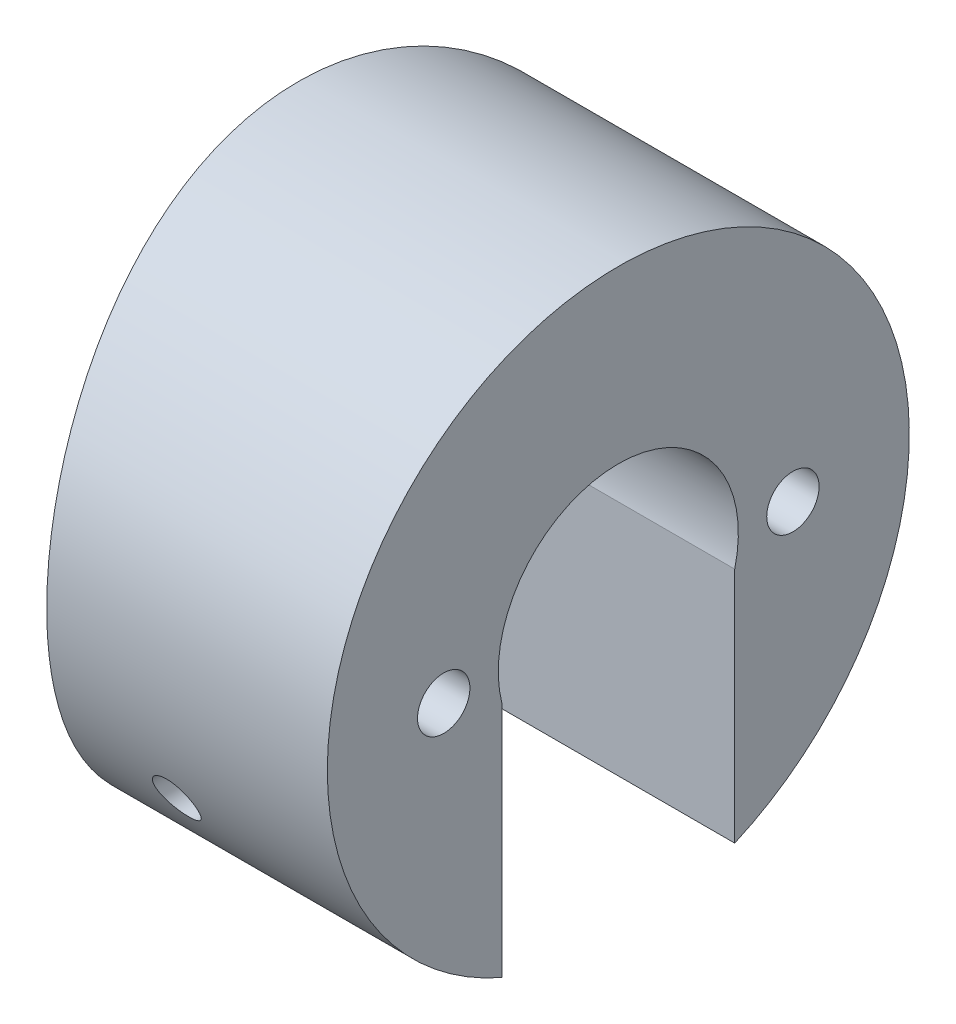
ISO-10303-21;
HEADER;
FILE_DESCRIPTION(('STEP AP214'),'2;1');
FILE_NAME('part.step','',(''),(''),'','','');
FILE_SCHEMA(('AUTOMOTIVE_DESIGN { 1 0 10303 214 1 1 1 1 }'));
ENDSEC;
DATA;
#1=APPLICATION_CONTEXT('core data for automotive mechanical design processes');
#2=APPLICATION_PROTOCOL_DEFINITION('international standard','automotive_design',2000,#1);
#3=PRODUCT_CONTEXT('',#1,'mechanical');
#4=PRODUCT('Part','Part','',(#3));
#5=PRODUCT_RELATED_PRODUCT_CATEGORY('part','',(#4));
#6=PRODUCT_DEFINITION_FORMATION('','',#4);
#7=PRODUCT_DEFINITION_CONTEXT('part definition',#1,'design');
#8=PRODUCT_DEFINITION('design','',#6,#7);
#9=PRODUCT_DEFINITION_SHAPE('','',#8);
#10=(LENGTH_UNIT() NAMED_UNIT(*) SI_UNIT(.MILLI.,.METRE.));
#11=(NAMED_UNIT(*) PLANE_ANGLE_UNIT() SI_UNIT($,.RADIAN.));
#12=(NAMED_UNIT(*) SI_UNIT($,.STERADIAN.) SOLID_ANGLE_UNIT());
#13=UNCERTAINTY_MEASURE_WITH_UNIT(LENGTH_MEASURE(1.E-05),#10,'distance_accuracy_value','');
#14=(GEOMETRIC_REPRESENTATION_CONTEXT(3) GLOBAL_UNCERTAINTY_ASSIGNED_CONTEXT((#13)) GLOBAL_UNIT_ASSIGNED_CONTEXT((#10,
#11,#12)) REPRESENTATION_CONTEXT('',''));
#15=CARTESIAN_POINT('',(0.,0.,0.));
#16=DIRECTION('',(0.,0.,1.));
#17=DIRECTION('',(1.,0.,0.));
#18=AXIS2_PLACEMENT_3D('',#15,#16,#17);
#19=CARTESIAN_POINT('',(22.,0.,0.));
#20=DIRECTION('',(-1.,0.,0.));
#21=DIRECTION('',(0.,0.,1.));
#22=AXIS2_PLACEMENT_3D('',#19,#20,#21);
#23=CYLINDRICAL_SURFACE('',#22,20.);
#24=CARTESIAN_POINT('',(22.,0.,0.));
#25=DIRECTION('',(1.,0.,0.));
#26=DIRECTION('',(0.,0.,-1.));
#27=AXIS2_PLACEMENT_3D('',#24,#25,#26);
#28=CIRCLE('',#27,20.);
#29=CARTESIAN_POINT('',(22.,-18.3303027798234,-8.));
#30=VERTEX_POINT('',#29);
#31=CARTESIAN_POINT('',(22.,-18.3303027798234,8.));
#32=VERTEX_POINT('',#31);
#33=EDGE_CURVE('E11',#30,#32,#28,.T.);
#34=ORIENTED_EDGE('',*,*,#33,.F.);
#35=DIRECTION('',(1.,0.,0.));
#36=VECTOR('',#35,1.);
#37=CARTESIAN_POINT('',(3.,-18.3303027798234,-8.));
#38=LINE('',#37,#36);
#39=CARTESIAN_POINT('',(3.,-18.3303027798234,-8.));
#40=VERTEX_POINT('',#39);
#41=EDGE_CURVE('E99',#40,#30,#38,.T.);
#42=ORIENTED_EDGE('',*,*,#41,.F.);
#43=CARTESIAN_POINT('',(3.,0.,0.));
#44=DIRECTION('',(1.,0.,0.));
#45=DIRECTION('',(0.,0.,-1.));
#46=AXIS2_PLACEMENT_3D('',#43,#44,#45);
#47=CIRCLE('',#46,20.);
#48=CARTESIAN_POINT('',(3.,-18.3303027798234,8.));
#49=VERTEX_POINT('',#48);
#50=EDGE_CURVE('E104',#49,#40,#47,.T.);
#51=ORIENTED_EDGE('',*,*,#50,.F.);
#52=DIRECTION('',(1.,0.,0.));
#53=VECTOR('',#52,1.);
#54=CARTESIAN_POINT('',(3.,-18.3303027798234,8.));
#55=LINE('',#54,#53);
#56=EDGE_CURVE('E88',#49,#32,#55,.T.);
#57=ORIENTED_EDGE('',*,*,#56,.T.);
#58=EDGE_LOOP('',(#34,#42,#51,#57));
#59=FACE_BOUND('',#58,.T.);
#60=CARTESIAN_POINT('',(2.71583852599519,0.,20.));
#61=CARTESIAN_POINT('',(2.71583720419908,0.550918368629555,19.9999979955262));
#62=CARTESIAN_POINT('',(2.70952307294359,1.10187503845956,19.9772172985185));
#63=CARTESIAN_POINT('',(2.68445738640584,2.1997741525709,19.8862887267972));
#64=CARTESIAN_POINT('',(2.66570466817441,2.74671621667071,19.818136610068));
#65=CARTESIAN_POINT('',(2.61632654224703,3.83283472874256,19.6370216003391));
#66=CARTESIAN_POINT('',(2.58569585426865,4.3720076122554,19.5240387775898));
#67=CARTESIAN_POINT('',(2.51348978860518,5.43849703067202,19.2542283143095));
#68=CARTESIAN_POINT('',(2.4719146207721,5.96581379269742,19.0974015144497));
#69=CARTESIAN_POINT('',(2.37912003517492,7.00423404343053,18.7414391089101));
#70=CARTESIAN_POINT('',(2.32791448031755,7.51535961864346,18.5423642668867));
#71=CARTESIAN_POINT('',(2.21730121654067,8.51880006208397,18.1033138320795));
#72=CARTESIAN_POINT('',(2.15789347626827,9.01111485839805,17.8633380829508));
#73=CARTESIAN_POINT('',(2.03254969547388,9.97379657844629,17.3442340818241));
#74=CARTESIAN_POINT('',(1.96661339403171,10.4441626238714,17.0651042648105));
#75=CARTESIAN_POINT('',(1.83003053260491,11.3599958582745,16.4696340357336));
#76=CARTESIAN_POINT('',(1.7593838927973,11.8054626250655,16.1532929930068));
#77=CARTESIAN_POINT('',(1.61365604823284,12.6785221427699,15.4779359071113));
#78=CARTESIAN_POINT('',(1.53851069818374,13.1054831814473,15.1181168094535));
#79=CARTESIAN_POINT('',(1.38737000475925,13.927766105388,14.3641394304632));
#80=CARTESIAN_POINT('',(1.31137464949402,14.3230875474461,13.9699806682643));
#81=CARTESIAN_POINT('',(1.16060916641372,15.0795578950723,13.1498357209291));
#82=CARTESIAN_POINT('',(1.0858391620587,15.4407033745363,12.7238463524525));
#83=CARTESIAN_POINT('',(0.939569981410207,16.1263607771595,11.8428070794406));
#84=CARTESIAN_POINT('',(0.868070822169677,16.4508725093371,11.3877570234234));
#85=CARTESIAN_POINT('',(0.729185410938314,17.0659051030184,10.4440019186042));
#86=CARTESIAN_POINT('',(0.661883679341344,17.3557961932459,9.95487366219161));
#87=CARTESIAN_POINT('',(0.534574695396652,17.8932321652887,8.95295539825706));
#88=CARTESIAN_POINT('',(0.47456754471148,18.140776456948,8.44016506110064));
#89=CARTESIAN_POINT('',(0.363570717175421,18.5915117491791,7.39457532709894));
#90=CARTESIAN_POINT('',(0.312579865798712,18.7947085275753,6.86177854741084));
#91=CARTESIAN_POINT('',(0.221081799935856,19.1550779678764,5.77996599006893));
#92=CARTESIAN_POINT('',(0.180574306630333,19.3122518538382,5.23095064420305));
#93=CARTESIAN_POINT('',(0.112021066604811,19.5761398421684,4.13351206913606));
#94=CARTESIAN_POINT('',(0.0837111230618383,19.6839273166135,3.58536334092753));
#95=CARTESIAN_POINT('',(0.0390282051130342,19.8533116675331,2.4814919821342));
#96=CARTESIAN_POINT('',(0.0226550656279587,19.9149091827889,1.92576945639901));
#97=CARTESIAN_POINT('',(0.00231287184317546,19.9913590232856,0.810972743979539));
#98=CARTESIAN_POINT('',(-0.00165798564619358,20.0062181439063,0.251899056370222));
#99=CARTESIAN_POINT('',(0.00291290405673769,19.9890756548836,-0.865473785968115));
#100=CARTESIAN_POINT('',(0.0114544730304575,19.9570747126834,-1.42377295161553));
#101=CARTESIAN_POINT('',(0.0404339869592479,19.8479018321359,-2.52135571769307));
#102=CARTESIAN_POINT('',(0.0605659765902263,19.7718913424225,-3.06076341662817));
#103=CARTESIAN_POINT('',(0.111941054107678,19.5762680740784,-4.13106184083254));
#104=CARTESIAN_POINT('',(0.143183922711534,19.4566561559578,-4.66195273397211));
#105=CARTESIAN_POINT('',(0.215946928393699,19.1748040741018,-5.71158477741187));
#106=CARTESIAN_POINT('',(0.257467421868833,19.0125624320849,-6.23032550569826));
#107=CARTESIAN_POINT('',(0.349687153961002,18.6467294349784,-7.25217189173379));
#108=CARTESIAN_POINT('',(0.400386537541423,18.443137426831,-7.7552773024053));
#109=CARTESIAN_POINT('',(0.510180514018348,17.9939181773118,-8.74748028027973));
#110=CARTESIAN_POINT('',(0.56935336775221,17.7478941379886,-9.2363894798745));
#111=CARTESIAN_POINT('',(0.694148187869852,17.2170307081084,-10.1917867213776));
#112=CARTESIAN_POINT('',(0.759770176450058,16.9321911839563,-10.6582746861091));
#113=CARTESIAN_POINT('',(0.895758703670676,16.3256216075623,-11.5659888188201));
#114=CARTESIAN_POINT('',(0.966126011005286,16.0038855725124,-12.0072108724652));
#115=CARTESIAN_POINT('',(1.10976484930651,15.3256861572232,-12.86160363953));
#116=CARTESIAN_POINT('',(1.18303644148927,14.9692220447586,-13.2747737611759));
#117=CARTESIAN_POINT('',(1.33284428810774,14.2123742214188,-14.0827611991668));
#118=CARTESIAN_POINT('',(1.40941167732709,13.8109775618472,-14.4766245221965));
#119=CARTESIAN_POINT('',(1.56147492697535,12.976336337106,-15.2292640199665));
#120=CARTESIAN_POINT('',(1.63697076475668,12.5430910999988,-15.5880394540543));
#121=CARTESIAN_POINT('',(1.78476784142875,11.6475416526047,-16.2680947594536));
#122=CARTESIAN_POINT('',(1.85706886150449,11.1852354571523,-16.5893720649617));
#123=CARTESIAN_POINT('',(1.99639557790192,10.234611796305,-17.1921338759909));
#124=CARTESIAN_POINT('',(2.06342129853029,9.74629445077744,-17.4736185648671));
#125=CARTESIAN_POINT('',(2.19062493961388,8.74378523222317,-17.9963259710692));
#126=CARTESIAN_POINT('',(2.25075776920321,8.22945155829049,-18.2372879132319));
#127=CARTESIAN_POINT('',(2.36185979063246,7.18129056511593,-18.6748920170533));
#128=CARTESIAN_POINT('',(2.41282891253737,6.64746309713994,-18.8715338404755));
#129=CARTESIAN_POINT('',(2.50400123028059,5.56425978861829,-19.2188038342948));
#130=CARTESIAN_POINT('',(2.54420661443119,5.0148871336236,-19.3694413584335));
#131=CARTESIAN_POINT('',(2.61257838013558,3.9045821944646,-19.6234178199717));
#132=CARTESIAN_POINT('',(2.64074512950106,3.34365026401526,-19.726758202429));
#133=CARTESIAN_POINT('',(2.68347601664323,2.23140756936548,-19.8828242188132));
#134=CARTESIAN_POINT('',(2.69842161742293,1.68031046308461,-19.9369705715048));
#135=CARTESIAN_POINT('',(2.71565957980208,0.575330472434,-19.9993798372479));
#136=CARTESIAN_POINT('',(2.71795219245947,0.021447643556242,-20.007643660691));
#137=CARTESIAN_POINT('',(2.70981317788567,-1.08494461677384,-19.9782160173178));
#138=CARTESIAN_POINT('',(2.69938279257724,-1.63745417699944,-19.9405290358714));
#139=CARTESIAN_POINT('',(2.66612442334991,-2.73707469895268,-19.8195451229315));
#140=CARTESIAN_POINT('',(2.64329650747951,-3.2841856902956,-19.736248441784));
#141=CARTESIAN_POINT('',(2.58650048179624,-4.35857469453259,-19.5268172340599));
#142=CARTESIAN_POINT('',(2.55275540867861,-4.88603174019373,-19.4015386960339));
#143=CARTESIAN_POINT('',(2.47500448611204,-5.92832913382976,-19.1088443049987));
#144=CARTESIAN_POINT('',(2.43099880347104,-6.4431696867621,-18.9414291370062));
#145=CARTESIAN_POINT('',(2.33397826704948,-7.45689813088412,-18.5657450389627));
#146=CARTESIAN_POINT('',(2.28096253333663,-7.95578445830565,-18.3574721183883));
#147=CARTESIAN_POINT('',(2.16740736150408,-8.93436137495364,-17.901636719721));
#148=CARTESIAN_POINT('',(2.10686775310598,-9.41405152941229,-17.6540733523817));
#149=CARTESIAN_POINT('',(1.97850743681508,-10.3616364681429,-17.11548661598));
#150=CARTESIAN_POINT('',(1.91055596885891,-10.8290404597269,-16.8236278146508));
#151=CARTESIAN_POINT('',(1.80546481084756,-11.5104486579926,-16.3580352677298));
#152=CARTESIAN_POINT('',(1.7699051851663,-11.7343127858372,-16.1981947427043));
#153=CARTESIAN_POINT('',(1.69796068661998,-12.1752320062407,-15.8694473258497));
#154=CARTESIAN_POINT('',(1.66157561938932,-12.3922854658165,-15.7005382856017));
#155=CARTESIAN_POINT('',(1.55156513794229,-13.0326274018404,-15.1806742573283));
#156=CARTESIAN_POINT('',(1.47707281306718,-13.4451720326612,-14.8165313697738));
#157=CARTESIAN_POINT('',(1.32780357156735,-14.238838083619,-14.0555240451393));
#158=CARTESIAN_POINT('',(1.25302665149377,-14.6199591216746,-13.6586592103083));
#159=CARTESIAN_POINT('',(1.14107642560371,-15.1714951873482,-13.0347928155079));
#160=CARTESIAN_POINT('',(1.10326703754078,-15.3543975844182,-12.8188356454708));
#161=CARTESIAN_POINT('',(1.02837237294425,-15.7108895289307,-12.3793376328829));
#162=CARTESIAN_POINT('',(0.991286922913547,-15.8844813255974,-12.1557986434176));
#163=CARTESIAN_POINT('',(0.881487716092404,-16.3909288120467,-11.4742218917358));
#164=CARTESIAN_POINT('',(0.810224975928936,-16.709486469754,-11.0051905556007));
#165=CARTESIAN_POINT('',(0.673619137262284,-17.3059300226829,-10.0412210351254));
#166=CARTESIAN_POINT('',(0.608275862067071,-17.5838171320454,-9.5462836247604));
#167=CARTESIAN_POINT('',(0.485340966914633,-18.0968632016066,-8.53378968620395));
#168=CARTESIAN_POINT('',(0.42774922037299,-18.3320228595772,-8.01623352756527));
#169=CARTESIAN_POINT('',(0.322366348557832,-18.7560885066583,-6.96615659435085));
#170=CARTESIAN_POINT('',(0.27450403894112,-18.945332565737,-6.43377951172493));
#171=CARTESIAN_POINT('',(0.189396189188018,-19.2782875530085,-5.35413230580835));
#172=CARTESIAN_POINT('',(0.152150629904706,-19.4219985633186,-4.80686220937866));
#173=CARTESIAN_POINT('',(0.089355017230541,-19.6626100524458,-3.7015671034604));
#174=CARTESIAN_POINT('',(0.0638028066489135,-19.7595191654669,-3.14354409748071));
#175=CARTESIAN_POINT('',(0.0251274383065969,-19.9056902137932,-2.02086921872247));
#176=CARTESIAN_POINT('',(0.0120039647265277,-19.9549533598029,-1.45621751475102));
#177=CARTESIAN_POINT('',(-0.00122587692838002,-20.0046098488838,-0.342006373503284));
#178=CARTESIAN_POINT('',(-0.00171951763861212,-20.0064571258491,0.207484191740474));
#179=CARTESIAN_POINT('',(0.00934129337656264,-19.9649517231006,1.30462513984724));
#180=CARTESIAN_POINT('',(0.0208954819801355,-19.921600030522,1.85227556263648));
#181=CARTESIAN_POINT('',(0.0557333619197663,-19.7900760707032,2.94176044403704));
#182=CARTESIAN_POINT('',(0.0790165566844254,-19.7019057009516,3.48359514787692));
#183=CARTESIAN_POINT('',(0.136675692879952,-19.4814944613198,4.55762066338955));
#184=CARTESIAN_POINT('',(0.171051683802468,-19.3492533948135,5.08981143202369));
#185=CARTESIAN_POINT('',(0.249691413832764,-19.0428564307918,6.13720586224474));
#186=CARTESIAN_POINT('',(0.293885071252294,-18.8689969684944,6.65250160135735));
#187=CARTESIAN_POINT('',(0.391125021808032,-18.4802494885517,7.66649937953356));
#188=CARTESIAN_POINT('',(0.444171243197424,-18.2653618034233,8.16520155304269));
#189=CARTESIAN_POINT('',(0.557737475067148,-17.796130197976,9.14285422000934));
#190=CARTESIAN_POINT('',(0.618258277244073,-17.5417820973358,9.6218026139965));
#191=CARTESIAN_POINT('',(0.745205728496283,-16.9954417686765,10.5569031827026));
#192=CARTESIAN_POINT('',(0.811632508969956,-16.7034487030534,11.0130548498786));
#193=CARTESIAN_POINT('',(0.950517062442474,-16.0755135025158,11.9116009680227));
#194=CARTESIAN_POINT('',(1.023088426918,-15.7386070110524,12.3533041573464));
#195=CARTESIAN_POINT('',(1.17070667771722,-15.0294641921924,13.2069343867793));
#196=CARTESIAN_POINT('',(1.24575360836312,-14.6572272320196,13.6188608933488));
#197=CARTESIAN_POINT('',(1.3963163105709,-13.8797585542876,14.4104174108039));
#198=CARTESIAN_POINT('',(1.47183219499279,-13.4745185854208,14.7900392961781));
#199=CARTESIAN_POINT('',(1.62125905673518,-12.6337145599183,15.5144184951873));
#200=CARTESIAN_POINT('',(1.69517002855606,-12.1981503993908,15.8591756893648));
#201=CARTESIAN_POINT('',(1.8409371391106,-11.2895484362826,16.5187203553849));
#202=CARTESIAN_POINT('',(1.91271216996388,-10.8158965832217,16.8326805368298));
#203=CARTESIAN_POINT('',(2.05034988167816,-9.84293313497395,17.4195128918304));
#204=CARTESIAN_POINT('',(2.11621229361854,-9.34362037428765,17.6923831968983));
#205=CARTESIAN_POINT('',(2.24000453908631,-8.32305943262842,18.1947791971653));
#206=CARTESIAN_POINT('',(2.29793893952687,-7.80182410827755,18.424329875673));
#207=CARTESIAN_POINT('',(2.40412815426479,-6.74084782086917,18.8383953760499));
#208=CARTESIAN_POINT('',(2.45238428596844,-6.20110938818302,19.0229163281093));
#209=CARTESIAN_POINT('',(2.53070778022321,-5.19676399129988,19.3189300896442));
#210=CARTESIAN_POINT('',(2.56245993531721,-4.73434070733534,19.4374352166582));
#211=CARTESIAN_POINT('',(2.61743880671688,-3.80156746564103,19.6411813358635));
#212=CARTESIAN_POINT('',(2.64066318278791,-3.33121536903039,19.726413197448));
#213=CARTESIAN_POINT('',(2.67803680605951,-2.38530218256131,19.8629973448247));
#214=CARTESIAN_POINT('',(2.69218689021724,-1.90974157722012,19.9143527551861));
#215=CARTESIAN_POINT('',(2.71108694192035,-0.956129746401022,19.9828499232124));
#216=CARTESIAN_POINT('',(2.71583967303146,-0.478079294611533,20.0000017394545));
#217=CARTESIAN_POINT('',(2.71583852599519,0.,20.));
#218=B_SPLINE_CURVE_WITH_KNOTS('',3,(#60,#61,#62,#63,#64,#65,#66,#67,#68,#69,#70,#71,#72,#73,
#74,#75,#76,#77,#78,#79,#80,#81,#82,#83,#84,#85,#86,#87,#88,#89,#90,#91,#92,#93,#94,#95,#96,#97,
#98,#99,#100,#101,#102,#103,#104,#105,#106,#107,#108,#109,#110,#111,#112,#113,#114,#115,#116,
#117,#118,#119,#120,#121,#122,#123,#124,#125,#126,#127,#128,#129,#130,#131,#132,#133,#134,#135,
#136,#137,#138,#139,#140,#141,#142,#143,#144,#145,#146,#147,#148,#149,#150,#151,#152,#153,#154,
#155,#156,#157,#158,#159,#160,#161,#162,#163,#164,#165,#166,#167,#168,#169,#170,#171,#172,#173,
#174,#175,#176,#177,#178,#179,#180,#181,#182,#183,#184,#185,#186,#187,#188,#189,#190,#191,#192,
#193,#194,#195,#196,#197,#198,#199,#200,#201,#202,#203,#204,#205,#206,#207,#208,#209,#210,#211,
#212,#213,#214,#215,#216,#217),.UNSPECIFIED.,.T.,.F.,(4,2,2,2,2,2,2,2,2,2,2,2,2,2,2,2,2,2,2,2,2,
2,2,2,2,2,2,2,2,2,2,2,2,2,2,2,2,2,2,2,2,2,2,2,2,2,2,2,2,2,2,2,2,2,2,2,2,2,2,2,2,2,2,2,2,2,2,2,2,
2,2,2,2,2,2,2,2,2,4),(0.,1.65231646724918,3.30478744006707,4.95799385294111,6.61116856915921,
8.26198151246524,9.91280076618765,11.563686023129,13.2145992636445,14.9028332573599,
16.5910908956041,18.2795176009991,19.9679531082101,21.6835116813128,23.3990941609388,
25.1144529919578,26.8297661959518,28.5057881570069,30.1817869391871,31.8575420336015,
33.5332732599203,35.1666751391554,36.8000447836081,38.4334710762973,40.0669231681476,
41.716572363803,43.3662272373671,45.016149983437,46.6661075248883,48.3667622821504,
50.0674529299349,51.7682598790722,53.4690589910375,55.1804159110329,56.8917858911011,
58.6028076779203,60.3137771848222,61.9735992876109,63.6333884564392,65.2930156221762,
66.9526336785195,68.5802863037356,70.2079124698566,71.8356976833209,73.4635197431162,
75.127110556269,75.95899168933,76.7910707802654,78.454956484337,80.1188624167173,
80.9751899408172,81.831309655657,83.54341297765,85.2554651776656,86.9674894160441,
88.6664972596542,90.3655020391462,92.0641932594963,93.7628413142374,95.4093386147798,
97.0557999569512,98.7021915986812,100.348590586058,101.983594533906,103.618585231283,
105.253749253225,106.888949664009,108.567756622397,110.246593654259,111.925851719845,
113.605115538909,115.321363854389,117.037690189607,118.753023639167,120.468123438766,
121.902141616166,123.336553030226,124.77083212392,126.204689363247),.UNSPECIFIED.);
#219=CARTESIAN_POINT('',(2.71583852599519,0.,20.));
#220=VERTEX_POINT('',#219);
#221=EDGE_CURVE('E173',#220,#220,#218,.T.);
#222=ORIENTED_EDGE('',*,*,#221,.F.);
#223=EDGE_LOOP('',(#222));
#224=FACE_BOUND('',#223,.T.);
#225=CARTESIAN_POINT('',(8.,-9.,17.8605710994918));
#226=CARTESIAN_POINT('',(8.00000186736244,-8.91015367651355,17.9058442748124));
#227=CARTESIAN_POINT('',(8.00808042025597,-8.81993190025972,17.950450048481));
#228=CARTESIAN_POINT('',(8.04071070550431,-8.64121173468298,18.037165362465));
#229=CARTESIAN_POINT('',(8.06526931777487,-8.55271408101232,18.0792738522476));
#230=CARTESIAN_POINT('',(8.13102062788308,-8.37994810516734,18.1599997523331));
#231=CARTESIAN_POINT('',(8.17227111767223,-8.29569563249405,18.1986044571187));
#232=CARTESIAN_POINT('',(8.2709536907754,-8.13494123819163,18.2710291032132));
#233=CARTESIAN_POINT('',(8.32837791139831,-8.0584355750399,18.3048513574901));
#234=CARTESIAN_POINT('',(8.45329310190416,-7.92189403751846,18.3643332026838));
#235=CARTESIAN_POINT('',(8.51969900031738,-7.86105140061585,18.390415903592));
#236=CARTESIAN_POINT('',(8.66363433405502,-7.7515394925722,18.4368430986259));
#237=CARTESIAN_POINT('',(8.74115695076546,-7.70286280908845,18.4571910877053));
#238=CARTESIAN_POINT('',(8.89749165021182,-7.62378920191763,18.4899840752858));
#239=CARTESIAN_POINT('',(8.9755566690478,-7.59213946257974,18.5029763789523));
#240=CARTESIAN_POINT('',(9.13655204280465,-7.54226303117205,18.5233637207404));
#241=CARTESIAN_POINT('',(9.2194803560505,-7.52403074921877,18.5307610898187));
#242=CARTESIAN_POINT('',(9.38248518618471,-7.50248751582391,18.53949315198));
#243=CARTESIAN_POINT('',(9.46243543310533,-7.49834901328044,18.5411641246779));
#244=CARTESIAN_POINT('',(9.62191048674785,-7.50283692665312,18.5393485526947));
#245=CARTESIAN_POINT('',(9.70143536215699,-7.51146121515312,18.5358628675714));
#246=CARTESIAN_POINT('',(9.85626744160028,-7.5408329494124,18.5239326079801));
#247=CARTESIAN_POINT('',(9.93162565561219,-7.56135118963444,18.5155817737425));
#248=CARTESIAN_POINT('',(10.0776648426645,-7.61352355823914,18.494189590032));
#249=CARTESIAN_POINT('',(10.1483456145494,-7.64517816517703,18.4811480389879));
#250=CARTESIAN_POINT('',(10.2847160534802,-7.71923140405273,18.450341492105));
#251=CARTESIAN_POINT('',(10.3502681204784,-7.76184360820129,18.4324822092192));
#252=CARTESIAN_POINT('',(10.4732035130853,-7.85594078373199,18.3925746229299));
#253=CARTESIAN_POINT('',(10.5305851913489,-7.9074275398226,18.3705254768364));
#254=CARTESIAN_POINT('',(10.6390678609954,-8.02070764599631,18.3213608170003));
#255=CARTESIAN_POINT('',(10.6896362456629,-8.08291703807592,18.2940305410212));
#256=CARTESIAN_POINT('',(10.7796673293928,-8.21339876044613,18.2358215172264));
#257=CARTESIAN_POINT('',(10.8191264454073,-8.28167303751204,18.204941629074));
#258=CARTESIAN_POINT('',(10.889276783848,-8.42813621214869,18.1376272518999));
#259=CARTESIAN_POINT('',(10.9189895804365,-8.50667951621718,18.1009451154285));
#260=CARTESIAN_POINT('',(10.9648032300346,-8.6664353453203,18.0250029823114));
#261=CARTESIAN_POINT('',(10.9808987561306,-8.74764890203191,17.9857419833114));
#262=CARTESIAN_POINT('',(11.0004195546185,-8.91799568264731,17.9019308841943));
#263=CARTESIAN_POINT('',(11.0025972037238,-9.00719361168679,17.8572202264461));
#264=CARTESIAN_POINT('',(10.9912960011289,-9.18412675657615,17.7668708253994));
#265=CARTESIAN_POINT('',(10.9778111185117,-9.27186139578218,17.721231731253));
#266=CARTESIAN_POINT('',(10.934283666409,-9.44906414369367,17.6274172066018));
#267=CARTESIAN_POINT('',(10.9032706467011,-9.53830510363157,17.5792590638266));
#268=CARTESIAN_POINT('',(10.8245509782745,-9.71028978027571,17.4848478691187));
#269=CARTESIAN_POINT('',(10.7768367127707,-9.79303051136449,17.4385956972006));
#270=CARTESIAN_POINT('',(10.6659331320213,-9.94848504341206,17.350376181559));
#271=CARTESIAN_POINT('',(10.6029102364992,-10.021294335778,17.3083692140255));
#272=CARTESIAN_POINT('',(10.4621277316663,-10.1548532448928,17.2303491874207));
#273=CARTESIAN_POINT('',(10.3843928190027,-10.2156227275394,17.1943262707001));
#274=CARTESIAN_POINT('',(10.2370052818273,-10.3085949244461,17.1387003186075));
#275=CARTESIAN_POINT('',(10.1701504857031,-10.3441435065226,17.1172417300545));
#276=CARTESIAN_POINT('',(10.0304526537022,-10.4051386032878,17.0802332048379));
#277=CARTESIAN_POINT('',(9.95761391619453,-10.4305922940331,17.0646790712703));
#278=CARTESIAN_POINT('',(9.80745429046643,-10.4702128940576,17.0403988877188));
#279=CARTESIAN_POINT('',(9.73011501950241,-10.4843294345523,17.0317033120168));
#280=CARTESIAN_POINT('',(9.57370181422493,-10.500246805875,17.0218950295168));
#281=CARTESIAN_POINT('',(9.49462834641962,-10.5020509090179,17.0207803079319));
#282=CARTESIAN_POINT('',(9.34358499709447,-10.4935894736447,17.0259976080138));
#283=CARTESIAN_POINT('',(9.27154051560404,-10.4842507616643,17.0317578048367));
#284=CARTESIAN_POINT('',(9.13028535862499,-10.4555090440633,17.0494167537694));
#285=CARTESIAN_POINT('',(9.06107473223479,-10.4361058641486,17.0613156121871));
#286=CARTESIAN_POINT('',(8.92621600533366,-10.387795877189,17.0907724093663));
#287=CARTESIAN_POINT('',(8.86063198022279,-10.3587587901093,17.1084078566445));
#288=CARTESIAN_POINT('',(8.73536647116244,-10.2924257856617,17.1483954912821));
#289=CARTESIAN_POINT('',(8.67568684785335,-10.255127276808,17.1707491585736));
#290=CARTESIAN_POINT('',(8.55712067752593,-10.1691427330998,17.2218258892827));
#291=CARTESIAN_POINT('',(8.49899029600891,-10.1196683088162,17.250973129143));
#292=CARTESIAN_POINT('',(8.39173862961168,-10.0136332506944,17.3127385974266));
#293=CARTESIAN_POINT('',(8.34262293871329,-9.95706825325699,17.3453589613621));
#294=CARTESIAN_POINT('',(8.24765305372977,-9.829922925566,17.4177690436407));
#295=CARTESIAN_POINT('',(8.20321835319464,-9.75848914586708,17.4579230874725));
#296=CARTESIAN_POINT('',(8.12714418101039,-9.61009983617849,17.5400448656084));
#297=CARTESIAN_POINT('',(8.09550554131163,-9.53314394754554,17.582012717643));
#298=CARTESIAN_POINT('',(8.04714389550394,-9.38095752730276,17.6636509065095));
#299=CARTESIAN_POINT('',(8.02953130429416,-9.30598375358801,17.7032762493439));
#300=CARTESIAN_POINT('',(8.00595799013279,-9.15409914858956,17.7822889743576));
#301=CARTESIAN_POINT('',(7.99999839572494,-9.0771881304224,17.8216763331209));
#302=CARTESIAN_POINT('',(8.,-9.,17.8605710994918));
#303=B_SPLINE_CURVE_WITH_KNOTS('',3,(#225,#226,#227,#228,#229,#230,#231,#232,#233,#234,#235,
#236,#237,#238,#239,#240,#241,#242,#243,#244,#245,#246,#247,#248,#249,#250,#251,#252,#253,#254,
#255,#256,#257,#258,#259,#260,#261,#262,#263,#264,#265,#266,#267,#268,#269,#270,#271,#272,#273,
#274,#275,#276,#277,#278,#279,#280,#281,#282,#283,#284,#285,#286,#287,#288,#289,#290,#291,#292,
#293,#294,#295,#296,#297,#298,#299,#300,#301,#302),.UNSPECIFIED.,.T.,.F.,(4,2,2,2,2,2,2,2,2,2,2,
2,2,2,2,2,2,2,2,2,2,2,2,2,2,2,2,2,2,2,2,2,2,2,2,2,2,2,4),(0.,0.301539464373684,
0.603204890538183,0.905923827547209,1.20849585414866,1.48826085466791,1.76785498513333,
2.02222923165376,2.27649744253904,2.5155513353352,2.75456538497871,2.98911973046031,
3.22368415651152,3.46322199026306,3.70280805237029,3.95582863775337,4.20893073606689,
4.4826897073176,4.75655572035916,5.05466313986715,5.352885384828,5.66951147462454,
5.98628215374574,6.29975229276808,6.61270081220398,6.84782049067785,7.08277273105848,
7.31876313250055,7.55469081159537,7.77228876568654,7.98989048821258,8.21056370997649,
8.4313062519477,8.6754727605798,8.91979027593269,9.19831535158318,9.47685853294617,
9.73588987467014,9.99494630124823),.UNSPECIFIED.);
#304=CARTESIAN_POINT('',(8.,-9.,17.8605710994918));
#305=VERTEX_POINT('',#304);
#306=EDGE_CURVE('E174',#305,#305,#303,.T.);
#307=ORIENTED_EDGE('',*,*,#306,.T.);
#308=EDGE_LOOP('',(#307));
#309=FACE_BOUND('',#308,.T.);
#310=ADVANCED_FACE('F39',(#59,#224,#309),#23,.T.);
#311=CARTESIAN_POINT('',(0.,0.,12.));
#312=DIRECTION('',(-1.,0.,0.));
#313=DIRECTION('',(0.,0.,1.));
#314=AXIS2_PLACEMENT_3D('',#311,#312,#313);
#315=CONICAL_SURFACE('',#314,3.36,0.785398163397447);
#316=CARTESIAN_POINT('',(1.56,0.,12.));
#317=DIRECTION('',(-1.,0.,0.));
#318=DIRECTION('',(0.,0.,1.));
#319=AXIS2_PLACEMENT_3D('',#316,#317,#318);
#320=CIRCLE('',#319,1.8);
#321=CARTESIAN_POINT('',(1.56,0.,13.8));
#322=VERTEX_POINT('',#321);
#323=EDGE_CURVE('E226',#322,#322,#320,.T.);
#324=ORIENTED_EDGE('',*,*,#323,.F.);
#325=EDGE_LOOP('',(#324));
#326=FACE_BOUND('',#325,.T.);
#327=CARTESIAN_POINT('',(0.671636959227669,-1.81271223825991,10.0147115624541));
#328=CARTESIAN_POINT('',(0.658299094807078,-1.72406864834599,9.91571880201776));
#329=CARTESIAN_POINT('',(0.646133716098434,-1.62707756593567,9.82392904557239));
#330=CARTESIAN_POINT('',(0.624317575602892,-1.41906739299504,9.65737843619577));
#331=CARTESIAN_POINT('',(0.614669594800241,-1.30803298800652,9.58263642738187));
#332=CARTESIAN_POINT('',(0.597856396754943,-1.07307260303088,9.45121709517483));
#333=CARTESIAN_POINT('',(0.590735786950107,-0.948960815726448,9.39486562892516));
#334=CARTESIAN_POINT('',(0.579267522390091,-0.693003188918012,9.30358577910839));
#335=CARTESIAN_POINT('',(0.57491944459199,-0.561158532677042,9.26865412726005));
#336=CARTESIAN_POINT('',(0.569013434218761,-0.293122792514784,9.22110739771962));
#337=CARTESIAN_POINT('',(0.567462086626993,-0.156922217124816,9.20854498991973));
#338=CARTESIAN_POINT('',(0.56717784687623,0.115678231917787,9.20624722467273));
#339=CARTESIAN_POINT('',(0.568445055454682,0.252078112519627,9.21651268311177));
#340=CARTESIAN_POINT('',(0.573796346444203,0.521451801825198,9.25962612152509));
#341=CARTESIAN_POINT('',(0.577885361528932,0.654419187427008,9.29251364579393));
#342=CARTESIAN_POINT('',(0.588860798278341,0.912889385628665,9.37999425655957));
#343=CARTESIAN_POINT('',(0.595747191926611,1.0383922729728,9.43458712567207));
#344=CARTESIAN_POINT('',(0.612251442078755,1.27816837496882,9.56384253485633));
#345=CARTESIAN_POINT('',(0.621865346359831,1.39245751842199,9.63847602731046));
#346=CARTESIAN_POINT('',(0.643729232650375,1.60673598983672,9.80571704122267));
#347=CARTESIAN_POINT('',(0.655979149616071,1.70672567053708,9.89832411917592));
#348=CARTESIAN_POINT('',(0.682918561401123,1.88932547229592,10.0985923031524));
#349=CARTESIAN_POINT('',(0.697601915556725,1.97197818210679,10.2062154114999));
#350=CARTESIAN_POINT('',(0.729188657866241,2.11790417928319,10.4335869300013));
#351=CARTESIAN_POINT('',(0.746092043373063,2.18117748975578,10.5533353256973));
#352=CARTESIAN_POINT('',(0.781813781195768,2.28670442824016,10.8016933829664));
#353=CARTESIAN_POINT('',(0.800634801800181,2.32892827237443,10.9303153090277));
#354=CARTESIAN_POINT('',(0.839747446035281,2.3911465990148,11.1926099142016));
#355=CARTESIAN_POINT('',(0.860039127157871,2.41114021198416,11.326282790671));
#356=CARTESIAN_POINT('',(0.901740947066156,2.42853224359443,11.5959804980217));
#357=CARTESIAN_POINT('',(0.923158534541156,2.42575436537925,11.7320155276176));
#358=CARTESIAN_POINT('',(0.966361437950391,2.39737636872933,12.001625280787));
#359=CARTESIAN_POINT('',(0.988146777776457,2.37177476185968,12.1351998433228));
#360=CARTESIAN_POINT('',(1.03163535633065,2.29815483492619,12.3975358848978));
#361=CARTESIAN_POINT('',(1.05333553462877,2.24991234525565,12.5262349980745));
#362=CARTESIAN_POINT('',(1.09569416058169,2.13229483019477,12.7737764631324));
#363=CARTESIAN_POINT('',(1.11635256520121,2.06291893262313,12.8926184079481));
#364=CARTESIAN_POINT('',(1.1559483078929,1.90462456675824,13.1175125222143));
#365=CARTESIAN_POINT('',(1.17487879605131,1.81563272151626,13.2235142902054));
#366=CARTESIAN_POINT('',(1.2101778624238,1.6206970881336,13.4190926071773));
#367=CARTESIAN_POINT('',(1.22654653451306,1.51475392144498,13.5086697580423));
#368=CARTESIAN_POINT('',(1.25589887134781,1.28982693075107,13.6679946188987));
#369=CARTESIAN_POINT('',(1.26891008414482,1.17096140671583,13.7379041604428));
#370=CARTESIAN_POINT('',(1.29114408653737,0.922825788534313,13.8567035351546));
#371=CARTESIAN_POINT('',(1.30036727369634,0.793556787964723,13.9055955741907));
#372=CARTESIAN_POINT('',(1.31447222268299,0.530594671084102,13.9801438522201));
#373=CARTESIAN_POINT('',(1.31942379088558,0.397011222517511,14.0061738338547));
#374=CARTESIAN_POINT('',(1.32500975678234,0.127287437998342,14.035527889756));
#375=CARTESIAN_POINT('',(1.32564451952568,-0.00885268077393557,14.0388538839776));
#376=CARTESIAN_POINT('',(1.32258625304606,-0.278062521946382,14.0227944230621));
#377=CARTESIAN_POINT('',(1.31894588176273,-0.411149442790605,14.0036853077843));
#378=CARTESIAN_POINT('',(1.30759387424445,-0.672176739221787,13.9438229129223));
#379=CARTESIAN_POINT('',(1.29988224514982,-0.800117123834492,13.9030696712984));
#380=CARTESIAN_POINT('',(1.2807151615284,-1.04757112650945,13.801076931113));
#381=CARTESIAN_POINT('',(1.26925158649331,-1.16706577680889,13.7397929901751));
#382=CARTESIAN_POINT('',(1.24308121896126,-1.39409793001292,13.5986053814547));
#383=CARTESIAN_POINT('',(1.22837418381111,-1.50163453739374,13.5187003205438));
#384=CARTESIAN_POINT('',(1.19608190113786,-1.7033899943326,13.3412855181393));
#385=CARTESIAN_POINT('',(1.17845782247898,-1.79739185712925,13.243536128939));
#386=CARTESIAN_POINT('',(1.14117735656972,-1.96770550562,13.0340179116017));
#387=CARTESIAN_POINT('',(1.12152078256045,-2.04401566359297,12.9222477949478));
#388=CARTESIAN_POINT('',(1.08057421136545,-2.17797464075842,12.6859399305319));
#389=CARTESIAN_POINT('',(1.05926355768201,-2.23531462291397,12.561230583523));
#390=CARTESIAN_POINT('',(1.01602747944825,-2.32809090669259,12.3040158108644));
#391=CARTESIAN_POINT('',(0.994102050628431,-2.36352705615799,12.1715103310648));
#392=CARTESIAN_POINT('',(0.950221449378389,-2.4115892086704,11.901641863733));
#393=CARTESIAN_POINT('',(0.928266790356752,-2.42408718467679,11.7642559490531));
#394=CARTESIAN_POINT('',(0.885107018226652,-2.42541505434271,11.4892129965518));
#395=CARTESIAN_POINT('',(0.863902059187363,-2.41424011144879,11.3515559090684));
#396=CARTESIAN_POINT('',(0.822944812403043,-2.36853987254199,11.0807558196895));
#397=CARTESIAN_POINT('',(0.803185182323441,-2.3341432278055,10.9475921689852));
#398=CARTESIAN_POINT('',(0.765488674508168,-2.24301614720104,10.6889837950214));
#399=CARTESIAN_POINT('',(0.747549638062971,-2.18631255965324,10.5635300013858));
#400=CARTESIAN_POINT('',(0.719916605057488,-2.07631568174121,10.3670277767719));
#401=CARTESIAN_POINT('',(0.709573173408281,-2.02909429709515,10.2926051424032));
#402=CARTESIAN_POINT('',(0.689859986155818,-1.92671168813263,10.1493011950777));
#403=CARTESIAN_POINT('',(0.680490182564257,-1.87155085545663,10.0804196090508));
#404=CARTESIAN_POINT('',(0.671636959227669,-1.81271223825991,10.0147115624541));
#405=B_SPLINE_CURVE_WITH_KNOTS('',3,(#327,#328,#329,#330,#331,#332,#333,#334,#335,#336,#337,
#338,#339,#340,#341,#342,#343,#344,#345,#346,#347,#348,#349,#350,#351,#352,#353,#354,#355,#356,
#357,#358,#359,#360,#361,#362,#363,#364,#365,#366,#367,#368,#369,#370,#371,#372,#373,#374,#375,
#376,#377,#378,#379,#380,#381,#382,#383,#384,#385,#386,#387,#388,#389,#390,#391,#392,#393,#394,
#395,#396,#397,#398,#399,#400,#401,#402,#403,#404),.UNSPECIFIED.,.T.,.F.,(4,2,2,2,2,2,2,2,2,2,2,
2,2,2,2,2,2,2,2,2,2,2,2,2,2,2,2,2,2,2,2,2,2,2,2,2,2,2,4),(0.,0.400332385860359,
0.801105166570256,1.2086357631799,1.61610416241382,2.02453071111254,2.43297185753662,
2.84212879622609,3.25128163721275,3.65984460858073,4.06839749978854,4.47593470133375,
4.88347141694961,5.29158315021119,5.69971084622475,6.11100123313634,6.52231844405042,
6.93779695378342,7.35329261274741,7.77036971109062,8.18743152248079,8.60095392946145,
9.01443292506127,9.42101944761779,9.82757158689616,10.2291681875614,10.6307640838952,
11.0332349849294,11.435736006266,11.8441043698086,12.252510290289,12.6672708298012,
13.0820342504662,13.4991056713037,13.9162623111533,14.3311266102529,14.745493104773,
15.0112333079454,15.2769604070618),.UNSPECIFIED.);
#406=CARTESIAN_POINT('',(0.671636959227669,-1.81271223825991,10.0147115624541));
#407=VERTEX_POINT('',#406);
#408=EDGE_CURVE('E165',#407,#407,#405,.T.);
#409=ORIENTED_EDGE('',*,*,#408,.F.);
#410=EDGE_LOOP('',(#409));
#411=FACE_BOUND('',#410,.T.);
#412=ADVANCED_FACE('F146',(#326,#411),#315,.F.);
#413=CARTESIAN_POINT('',(0.,0.,-12.));
#414=DIRECTION('',(-1.,0.,0.));
#415=DIRECTION('',(0.,0.,1.));
#416=AXIS2_PLACEMENT_3D('',#413,#414,#415);
#417=CONICAL_SURFACE('',#416,3.36,0.785398163397447);
#418=CARTESIAN_POINT('',(1.56,0.,-12.));
#419=DIRECTION('',(-1.,0.,0.));
#420=DIRECTION('',(0.,0.,1.));
#421=AXIS2_PLACEMENT_3D('',#418,#419,#420);
#422=CIRCLE('',#421,1.8);
#423=CARTESIAN_POINT('',(1.56,0.,-10.2));
#424=VERTEX_POINT('',#423);
#425=EDGE_CURVE('E218',#424,#424,#422,.T.);
#426=ORIENTED_EDGE('',*,*,#425,.F.);
#427=EDGE_LOOP('',(#426));
#428=FACE_BOUND('',#427,.T.);
#429=CARTESIAN_POINT('',(1.27134306380063,-1.13890514883794,-13.7508234802629));
#430=CARTESIAN_POINT('',(1.28311920184101,-1.02022869962257,-13.8139654730309));
#431=CARTESIAN_POINT('',(1.29315692167861,-0.896079442599593,-13.867341457792));
#432=CARTESIAN_POINT('',(1.30929211121695,-0.640316355167913,-13.9528305238451));
#433=CARTESIAN_POINT('',(1.31538554390936,-0.50869502638635,-13.9849218209201));
#434=CARTESIAN_POINT('',(1.32333143781653,-0.242020554212929,-14.0267233857694));
#435=CARTESIAN_POINT('',(1.3251906481051,-0.106973219619643,-14.0364692708377));
#436=CARTESIAN_POINT('',(1.32459812228814,0.162817101138736,-14.0333588477122));
#437=CARTESIAN_POINT('',(1.32214741607922,0.29756015231163,-14.0205079392428));
#438=CARTESIAN_POINT('',(1.31308780735718,0.561904779714527,-13.972814524156));
#439=CARTESIAN_POINT('',(1.30651003182743,0.691537190619748,-13.938136633781));
#440=CARTESIAN_POINT('',(1.28952415188866,0.943107352616562,-13.8480264994686));
#441=CARTESIAN_POINT('',(1.27911582931312,1.06504466497495,-13.7925930734089));
#442=CARTESIAN_POINT('',(1.25483238002897,1.29878672713741,-13.6621618742755));
#443=CARTESIAN_POINT('',(1.24093188220234,1.41050878430078,-13.5870207382113));
#444=CARTESIAN_POINT('',(1.21028536562861,1.61981019995172,-13.4195841643153));
#445=CARTESIAN_POINT('',(1.1935391008735,1.71738833438711,-13.3272872433526));
#446=CARTESIAN_POINT('',(1.15756248583709,1.89733320543718,-13.1264988633973));
#447=CARTESIAN_POINT('',(1.13829580849943,1.9794233532134,-13.0177660111336));
#448=CARTESIAN_POINT('',(1.09822425992497,2.12419102757982,-12.7883185139061));
#449=CARTESIAN_POINT('',(1.07741926846309,2.18686703489074,-12.6676029321937));
#450=CARTESIAN_POINT('',(1.03472382757772,2.29179170625938,-12.4158932862123));
#451=CARTESIAN_POINT('',(1.01282283964779,2.33376649767886,-12.2847867405499));
#452=CARTESIAN_POINT('',(0.968916514676296,2.39485053755255,-12.0173636875398));
#453=CARTESIAN_POINT('',(0.946911175850146,2.41395939353193,-11.8810470908073));
#454=CARTESIAN_POINT('',(0.903446819371993,2.42868588018866,-11.606898197589));
#455=CARTESIAN_POINT('',(0.88198844962391,2.42427684417203,-11.4690643574394));
#456=CARTESIAN_POINT('',(0.840250120869571,2.39190267587802,-11.196007128319));
#457=CARTESIAN_POINT('',(0.819970106604674,2.36393864915975,-11.0607836171366));
#458=CARTESIAN_POINT('',(0.781271658530884,2.2854794541563,-10.7980488174745));
#459=CARTESIAN_POINT('',(0.762838721955637,2.23518001671347,-10.6704812296361));
#460=CARTESIAN_POINT('',(0.728045687095265,2.11345453999207,-10.4255512504194));
#461=CARTESIAN_POINT('',(0.711685472208982,2.04202968988006,-10.3081882850958));
#462=CARTESIAN_POINT('',(0.681492923706362,1.88085168366884,-10.0881979977857));
#463=CARTESIAN_POINT('',(0.667637841555278,1.79128096066605,-9.98544009389333));
#464=CARTESIAN_POINT('',(0.642476411279358,1.59594248164284,-9.79631605946908));
#465=CARTESIAN_POINT('',(0.631170002117283,1.49017511361185,-9.70994953639387));
#466=CARTESIAN_POINT('',(0.611282893988912,1.26592082286237,-9.55639883467152));
#467=CARTESIAN_POINT('',(0.602691660676489,1.1474855057908,-9.48914062486629));
#468=CARTESIAN_POINT('',(0.588254006973254,0.900925948799975,-9.37525305037861));
#469=CARTESIAN_POINT('',(0.582407611806675,0.772801619854184,-9.32862387527098));
#470=CARTESIAN_POINT('',(0.573493985179088,0.510292763537352,-9.25724093195468));
#471=CARTESIAN_POINT('',(0.570431071038218,0.375898849962024,-9.23252114778418));
#472=CARTESIAN_POINT('',(0.567116939061963,0.104836716884946,-9.20576476981984));
#473=CARTESIAN_POINT('',(0.56686576530795,-0.0318315382394048,-9.20372853164982));
#474=CARTESIAN_POINT('',(0.569179213428108,-0.30390223190609,-9.22241852670821));
#475=CARTESIAN_POINT('',(0.571750435275219,-0.439300953577559,-9.24319811316414));
#476=CARTESIAN_POINT('',(0.579705276547978,-0.704658211051121,-9.30702731176654));
#477=CARTESIAN_POINT('',(0.585088886992056,-0.834616764225362,-9.35007685279228));
#478=CARTESIAN_POINT('',(0.598628111924355,-1.08531165425618,-9.45720667677793));
#479=CARTESIAN_POINT('',(0.606782096357713,-1.20605336314771,-9.52127459201711));
#480=CARTESIAN_POINT('',(0.625790019932105,-1.43493841646176,-9.66862902650153));
#481=CARTESIAN_POINT('',(0.636643895887044,-1.54308205563246,-9.75191509597721));
#482=CARTESIAN_POINT('',(0.660892578110587,-1.74340609115932,-9.93506896661894));
#483=CARTESIAN_POINT('',(0.674280553035219,-1.83562815892966,-10.0348920994363));
#484=CARTESIAN_POINT('',(0.703419233024797,-2.00185058361124,-10.2483985391919));
#485=CARTESIAN_POINT('',(0.719169916540397,-2.07585110669784,-10.3620817197163));
#486=CARTESIAN_POINT('',(0.752750937163369,-2.20357739167249,-10.600019919072));
#487=CARTESIAN_POINT('',(0.770581094630779,-2.25730490319372,-10.72427402446));
#488=CARTESIAN_POINT('',(0.807948741612735,-2.3430731236029,-10.9798084125188));
#489=CARTESIAN_POINT('',(0.827486282487375,-2.37511317985306,-11.1110889065056));
#490=CARTESIAN_POINT('',(0.867927843002847,-2.41685781138074,-11.3777929950169));
#491=CARTESIAN_POINT('',(0.888839538649182,-2.42642358714273,-11.5132371292095));
#492=CARTESIAN_POINT('',(0.931360684374556,-2.42267222012113,-11.7836926697025));
#493=CARTESIAN_POINT('',(0.9529701506921,-2.40935454441711,-11.9187040658516));
#494=CARTESIAN_POINT('',(0.99647516367164,-2.36005276562976,-12.1859274234779));
#495=CARTESIAN_POINT('',(1.01837139090162,-2.3238404286687,-12.3180971748042));
#496=CARTESIAN_POINT('',(1.0615305360073,-2.22958311316333,-12.5745641143709));
#497=CARTESIAN_POINT('',(1.08279326170333,-2.17153158079103,-12.6988589262877));
#498=CARTESIAN_POINT('',(1.12407695453868,-2.03473992918734,-12.9368737464327));
#499=CARTESIAN_POINT('',(1.14408841084098,-1.95586072505623,-13.050515428247));
#500=CARTESIAN_POINT('',(1.18192928491008,-1.77981419247533,-13.2628832585139));
#501=CARTESIAN_POINT('',(1.19976132563837,-1.6826692120267,-13.3616273706782));
#502=CARTESIAN_POINT('',(1.2266458490631,-1.51049278436065,-13.5090956327727));
#503=CARTESIAN_POINT('',(1.23655453003853,-1.44001250811373,-13.5630639283498));
#504=CARTESIAN_POINT('',(1.25500985062753,-1.29345414427129,-13.6630525988947));
#505=CARTESIAN_POINT('',(1.26355648221297,-1.21737602368509,-13.7090729270161));
#506=CARTESIAN_POINT('',(1.27134306380063,-1.13890514883794,-13.7508234802629));
#507=B_SPLINE_CURVE_WITH_KNOTS('',3,(#429,#430,#431,#432,#433,#434,#435,#436,#437,#438,#439,
#440,#441,#442,#443,#444,#445,#446,#447,#448,#449,#450,#451,#452,#453,#454,#455,#456,#457,#458,
#459,#460,#461,#462,#463,#464,#465,#466,#467,#468,#469,#470,#471,#472,#473,#474,#475,#476,#477,
#478,#479,#480,#481,#482,#483,#484,#485,#486,#487,#488,#489,#490,#491,#492,#493,#494,#495,#496,
#497,#498,#499,#500,#501,#502,#503,#504,#505,#506),.UNSPECIFIED.,.T.,.F.,(4,2,2,2,2,2,2,2,2,2,2,
2,2,2,2,2,2,2,2,2,2,2,2,2,2,2,2,2,2,2,2,2,2,2,2,2,2,2,4),(0.,0.404506735641991,
0.809426835138208,1.21370106538582,1.61787870348726,2.0190440233395,2.42023219485872,
2.82442389206614,3.22865054822537,3.63952577740923,4.0504331520597,4.46663992695439,
4.88285384559097,5.2995398051284,5.71620620850061,6.12929118550757,6.54235291405123,
6.95145137105913,7.36054002967639,7.76802144593361,8.17550660674856,8.58362272429831,
8.99174524012473,9.40082415867759,9.80990177081469,10.2187391022273,10.627566866439,
11.0353078297455,11.4430450744313,11.8507471218861,12.2584614377205,12.6686872230428,
13.0789225620228,13.4933133942525,13.9078286823239,14.3251853172012,14.7420346043478,
15.0094997210841,15.2769664142423),.UNSPECIFIED.);
#508=CARTESIAN_POINT('',(1.27134306380063,-1.13890514883794,-13.7508234802629));
#509=VERTEX_POINT('',#508);
#510=EDGE_CURVE('E43',#509,#509,#507,.T.);
#511=ORIENTED_EDGE('',*,*,#510,.F.);
#512=EDGE_LOOP('',(#511));
#513=FACE_BOUND('',#512,.T.);
#514=ADVANCED_FACE('F150',(#428,#513),#417,.F.);
#515=CARTESIAN_POINT('',(22.,0.,0.));
#516=DIRECTION('',(1.,0.,0.));
#517=DIRECTION('',(0.,0.,-1.));
#518=AXIS2_PLACEMENT_3D('',#515,#516,#517);
#519=PLANE('',#518);
#520=CARTESIAN_POINT('',(22.,0.,-12.));
#521=DIRECTION('',(1.,0.,0.));
#522=DIRECTION('',(0.,0.,-1.));
#523=AXIS2_PLACEMENT_3D('',#520,#521,#522);
#524=CIRCLE('',#523,1.8);
#525=CARTESIAN_POINT('',(22.,0.,-13.8));
#526=VERTEX_POINT('',#525);
#527=EDGE_CURVE('E221',#526,#526,#524,.T.);
#528=ORIENTED_EDGE('',*,*,#527,.F.);
#529=EDGE_LOOP('',(#528));
#530=FACE_BOUND('',#529,.T.);
#531=CARTESIAN_POINT('',(22.,0.,12.));
#532=DIRECTION('',(1.,0.,0.));
#533=DIRECTION('',(0.,0.,-1.));
#534=AXIS2_PLACEMENT_3D('',#531,#532,#533);
#535=CIRCLE('',#534,1.8);
#536=CARTESIAN_POINT('',(22.,0.,10.2));
#537=VERTEX_POINT('',#536);
#538=EDGE_CURVE('E119',#537,#537,#535,.T.);
#539=ORIENTED_EDGE('',*,*,#538,.F.);
#540=EDGE_LOOP('',(#539));
#541=FACE_BOUND('',#540,.T.);
#542=DIRECTION('',(0.,1.,0.));
#543=VECTOR('',#542,1.);
#544=CARTESIAN_POINT('',(22.,-2.01556443707464,-8.));
#545=LINE('',#544,#543);
#546=CARTESIAN_POINT('',(22.,-2.01556443707464,-8.));
#547=VERTEX_POINT('',#546);
#548=EDGE_CURVE('E122',#30,#547,#545,.T.);
#549=ORIENTED_EDGE('',*,*,#548,.F.);
#550=ORIENTED_EDGE('',*,*,#33,.T.);
#551=DIRECTION('',(0.,-1.,0.));
#552=VECTOR('',#551,1.);
#553=CARTESIAN_POINT('',(22.,-18.3303027798234,8.));
#554=LINE('',#553,#552);
#555=CARTESIAN_POINT('',(22.,-2.01556443707464,8.));
#556=VERTEX_POINT('',#555);
#557=EDGE_CURVE('E94',#556,#32,#554,.T.);
#558=ORIENTED_EDGE('',*,*,#557,.F.);
#559=CARTESIAN_POINT('',(22.,0.,0.));
#560=DIRECTION('',(1.,0.,0.));
#561=DIRECTION('',(0.,0.,-1.));
#562=AXIS2_PLACEMENT_3D('',#559,#560,#561);
#563=CIRCLE('',#562,8.25);
#564=EDGE_CURVE('E61',#547,#556,#563,.T.);
#565=ORIENTED_EDGE('',*,*,#564,.F.);
#566=EDGE_LOOP('',(#549,#550,#558,#565));
#567=FACE_BOUND('',#566,.T.);
#568=ADVANCED_FACE('F132',(#530,#541,#567),#519,.T.);
#569=CARTESIAN_POINT('',(3.,0.,0.));
#570=DIRECTION('',(1.,0.,0.));
#571=DIRECTION('',(0.,0.,-1.));
#572=AXIS2_PLACEMENT_3D('',#569,#570,#571);
#573=CYLINDRICAL_SURFACE('',#572,8.25);
#574=ORIENTED_EDGE('',*,*,#564,.T.);
#575=DIRECTION('',(1.,0.,0.));
#576=VECTOR('',#575,1.);
#577=CARTESIAN_POINT('',(3.,-2.01556443707464,8.));
#578=LINE('',#577,#576);
#579=CARTESIAN_POINT('',(3.,-2.01556443707464,8.));
#580=VERTEX_POINT('',#579);
#581=EDGE_CURVE('E83',#580,#556,#578,.T.);
#582=ORIENTED_EDGE('',*,*,#581,.F.);
#583=CARTESIAN_POINT('',(3.,0.,0.));
#584=DIRECTION('',(1.,0.,0.));
#585=DIRECTION('',(0.,0.,-1.));
#586=AXIS2_PLACEMENT_3D('',#583,#584,#585);
#587=CIRCLE('',#586,8.25);
#588=CARTESIAN_POINT('',(3.,-2.01556443707464,-8.));
#589=VERTEX_POINT('',#588);
#590=EDGE_CURVE('E105',#589,#580,#587,.T.);
#591=ORIENTED_EDGE('',*,*,#590,.F.);
#592=DIRECTION('',(1.,0.,0.));
#593=VECTOR('',#592,1.);
#594=CARTESIAN_POINT('',(3.,-2.01556443707464,-8.));
#595=LINE('',#594,#593);
#596=EDGE_CURVE('E54',#589,#547,#595,.T.);
#597=ORIENTED_EDGE('',*,*,#596,.T.);
#598=EDGE_LOOP('',(#574,#582,#591,#597));
#599=FACE_BOUND('',#598,.T.);
#600=ADVANCED_FACE('F135',(#599),#573,.F.);
#601=CARTESIAN_POINT('',(3.,-2.01556443707464,-8.));
#602=DIRECTION('',(0.,0.,-1.));
#603=DIRECTION('',(0.,1.,0.));
#604=AXIS2_PLACEMENT_3D('',#601,#602,#603);
#605=PLANE('',#604);
#606=ORIENTED_EDGE('',*,*,#548,.T.);
#607=ORIENTED_EDGE('',*,*,#596,.F.);
#608=DIRECTION('',(0.,1.,0.));
#609=VECTOR('',#608,1.);
#610=CARTESIAN_POINT('',(3.,-2.01556443707464,-8.));
#611=LINE('',#610,#609);
#612=EDGE_CURVE('E111',#40,#589,#611,.T.);
#613=ORIENTED_EDGE('',*,*,#612,.F.);
#614=ORIENTED_EDGE('',*,*,#41,.T.);
#615=EDGE_LOOP('',(#606,#607,#613,#614));
#616=FACE_BOUND('',#615,.T.);
#617=ADVANCED_FACE('F133',(#616),#605,.F.);
#618=CARTESIAN_POINT('',(3.,-18.3303027798234,8.));
#619=DIRECTION('',(0.,0.,1.));
#620=DIRECTION('',(1.,0.,0.));
#621=AXIS2_PLACEMENT_3D('',#618,#619,#620);
#622=PLANE('',#621);
#623=CARTESIAN_POINT('',(9.5,-9.,8.));
#624=DIRECTION('',(0.,0.,1.));
#625=DIRECTION('',(1.,0.,0.));
#626=AXIS2_PLACEMENT_3D('',#623,#624,#625);
#627=CIRCLE('',#626,1.5);
#628=CARTESIAN_POINT('',(11.,-9.,8.));
#629=VERTEX_POINT('',#628);
#630=EDGE_CURVE('E202',#629,#629,#627,.T.);
#631=ORIENTED_EDGE('',*,*,#630,.T.);
#632=EDGE_LOOP('',(#631));
#633=FACE_BOUND('',#632,.T.);
#634=ORIENTED_EDGE('',*,*,#557,.T.);
#635=ORIENTED_EDGE('',*,*,#56,.F.);
#636=DIRECTION('',(0.,-1.,0.));
#637=VECTOR('',#636,1.);
#638=CARTESIAN_POINT('',(3.,-18.3303027798234,8.));
#639=LINE('',#638,#637);
#640=EDGE_CURVE('E91',#580,#49,#639,.T.);
#641=ORIENTED_EDGE('',*,*,#640,.F.);
#642=ORIENTED_EDGE('',*,*,#581,.T.);
#643=EDGE_LOOP('',(#634,#635,#641,#642));
#644=FACE_BOUND('',#643,.T.);
#645=ADVANCED_FACE('F90',(#633,#644),#622,.F.);
#646=CARTESIAN_POINT('',(3.,0.,0.));
#647=DIRECTION('',(1.,0.,0.));
#648=DIRECTION('',(0.,0.,-1.));
#649=AXIS2_PLACEMENT_3D('',#646,#647,#648);
#650=PLANE('',#649);
#651=ORIENTED_EDGE('',*,*,#590,.T.);
#652=ORIENTED_EDGE('',*,*,#640,.T.);
#653=ORIENTED_EDGE('',*,*,#50,.T.);
#654=ORIENTED_EDGE('',*,*,#612,.T.);
#655=EDGE_LOOP('',(#651,#652,#653,#654));
#656=FACE_BOUND('',#655,.T.);
#657=ADVANCED_FACE('F102',(#656),#650,.T.);
#658=CARTESIAN_POINT('',(0.,0.,12.));
#659=DIRECTION('',(-1.,0.,0.));
#660=DIRECTION('',(0.,0.,1.));
#661=AXIS2_PLACEMENT_3D('',#658,#659,#660);
#662=CYLINDRICAL_SURFACE('',#661,1.8);
#663=ORIENTED_EDGE('',*,*,#323,.T.);
#664=EDGE_LOOP('',(#663));
#665=FACE_BOUND('',#664,.T.);
#666=ORIENTED_EDGE('',*,*,#538,.T.);
#667=EDGE_LOOP('',(#666));
#668=FACE_BOUND('',#667,.T.);
#669=ADVANCED_FACE('F163',(#665,#668),#662,.F.);
#670=CARTESIAN_POINT('',(0.,0.,-12.));
#671=DIRECTION('',(-1.,0.,0.));
#672=DIRECTION('',(0.,0.,1.));
#673=AXIS2_PLACEMENT_3D('',#670,#671,#672);
#674=CYLINDRICAL_SURFACE('',#673,1.8);
#675=ORIENTED_EDGE('',*,*,#425,.T.);
#676=EDGE_LOOP('',(#675));
#677=FACE_BOUND('',#676,.T.);
#678=ORIENTED_EDGE('',*,*,#527,.T.);
#679=EDGE_LOOP('',(#678));
#680=FACE_BOUND('',#679,.T.);
#681=ADVANCED_FACE('F162',(#677,#680),#674,.F.);
#682=CARTESIAN_POINT('',(75.,-20.,0.));
#683=DIRECTION('',(0.,1.,0.));
#684=DIRECTION('',(0.,0.,1.));
#685=AXIS2_PLACEMENT_3D('',#682,#683,#684);
#686=CYLINDRICAL_SURFACE('',#685,75.);
#687=ORIENTED_EDGE('',*,*,#510,.T.);
#688=EDGE_LOOP('',(#687));
#689=FACE_BOUND('',#688,.T.);
#690=ORIENTED_EDGE('',*,*,#221,.T.);
#691=EDGE_LOOP('',(#690));
#692=FACE_BOUND('',#691,.T.);
#693=ORIENTED_EDGE('',*,*,#408,.T.);
#694=EDGE_LOOP('',(#693));
#695=FACE_BOUND('',#694,.T.);
#696=ADVANCED_FACE('F185',(#689,#692,#695),#686,.T.);
#697=CARTESIAN_POINT('',(9.5,-9.,20.001));
#698=DIRECTION('',(0.,0.,-1.));
#699=DIRECTION('',(-1.,0.,0.));
#700=AXIS2_PLACEMENT_3D('',#697,#698,#699);
#701=CYLINDRICAL_SURFACE('',#700,1.5);
#702=ORIENTED_EDGE('',*,*,#630,.F.);
#703=EDGE_LOOP('',(#702));
#704=FACE_BOUND('',#703,.T.);
#705=ORIENTED_EDGE('',*,*,#306,.F.);
#706=EDGE_LOOP('',(#705));
#707=FACE_BOUND('',#706,.T.);
#708=ADVANCED_FACE('F188',(#704,#707),#701,.F.);
#709=CLOSED_SHELL('',(#310,#412,#514,#568,#600,#617,#645,#657,#669,#681,#696,#708));
#710=MANIFOLD_SOLID_BREP('B2',#709);
#711=ADVANCED_BREP_SHAPE_REPRESENTATION('',(#18,#710),#14);
#712=SHAPE_DEFINITION_REPRESENTATION(#9,#711);
ENDSEC;
END-ISO-10303-21;
